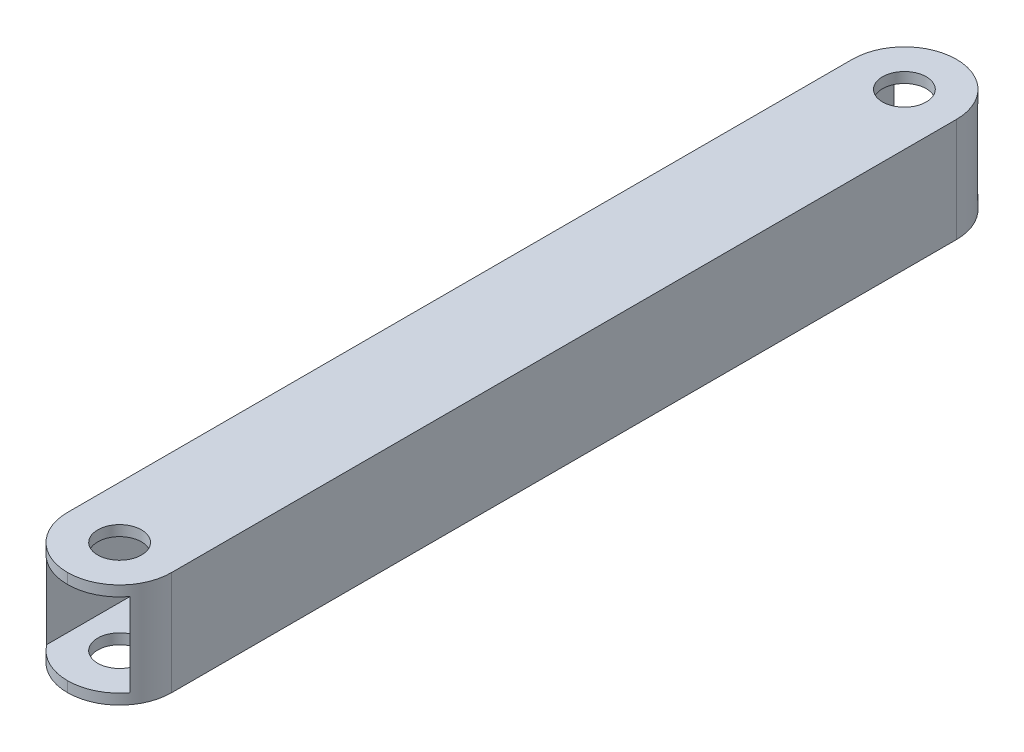
ISO-10303-21;
HEADER;
FILE_DESCRIPTION(('STEP AP214'),'2;1');
FILE_NAME('part.step','',(''),(''),'','','');
FILE_SCHEMA(('AUTOMOTIVE_DESIGN { 1 0 10303 214 1 1 1 1 }'));
ENDSEC;
DATA;
#1=APPLICATION_CONTEXT('core data for automotive mechanical design processes');
#2=APPLICATION_PROTOCOL_DEFINITION('international standard','automotive_design',2000,#1);
#3=PRODUCT_CONTEXT('',#1,'mechanical');
#4=PRODUCT('Part','Part','',(#3));
#5=PRODUCT_RELATED_PRODUCT_CATEGORY('part','',(#4));
#6=PRODUCT_DEFINITION_FORMATION('','',#4);
#7=PRODUCT_DEFINITION_CONTEXT('part definition',#1,'design');
#8=PRODUCT_DEFINITION('design','',#6,#7);
#9=PRODUCT_DEFINITION_SHAPE('','',#8);
#10=(LENGTH_UNIT() NAMED_UNIT(*) SI_UNIT(.MILLI.,.METRE.));
#11=(NAMED_UNIT(*) PLANE_ANGLE_UNIT() SI_UNIT($,.RADIAN.));
#12=(NAMED_UNIT(*) SI_UNIT($,.STERADIAN.) SOLID_ANGLE_UNIT());
#13=UNCERTAINTY_MEASURE_WITH_UNIT(LENGTH_MEASURE(1.E-05),#10,'distance_accuracy_value','');
#14=(GEOMETRIC_REPRESENTATION_CONTEXT(3) GLOBAL_UNCERTAINTY_ASSIGNED_CONTEXT((#13)) GLOBAL_UNIT_ASSIGNED_CONTEXT((#10,
#11,#12)) REPRESENTATION_CONTEXT('',''));
#15=CARTESIAN_POINT('',(0.,0.,0.));
#16=DIRECTION('',(0.,0.,1.));
#17=DIRECTION('',(1.,0.,0.));
#18=AXIS2_PLACEMENT_3D('',#15,#16,#17);
#19=CARTESIAN_POINT('',(5.,5.,85.3740671584067));
#20=DIRECTION('',(-1.,0.,0.));
#21=DIRECTION('',(0.,-1.,0.));
#22=AXIS2_PLACEMENT_3D('',#19,#20,#21);
#23=PLANE('',#22);
#24=DIRECTION('',(0.,0.,-1.));
#25=VECTOR('',#24,1.);
#26=CARTESIAN_POINT('',(5.,5.,85.3740671584067));
#27=LINE('',#26,#25);
#28=CARTESIAN_POINT('',(5.,5.,80.3740671584067));
#29=VERTEX_POINT('',#28);
#30=CARTESIAN_POINT('',(5.,5.,5.));
#31=VERTEX_POINT('',#30);
#32=EDGE_CURVE('E146',#29,#31,#27,.T.);
#33=ORIENTED_EDGE('',*,*,#32,.F.);
#34=DIRECTION('',(0.,1.,0.));
#35=VECTOR('',#34,1.);
#36=CARTESIAN_POINT('',(5.,-5.,80.3740671584067));
#37=LINE('',#36,#35);
#38=CARTESIAN_POINT('',(5.,-5.,80.3740671584067));
#39=VERTEX_POINT('',#38);
#40=EDGE_CURVE('E171',#29,#39,#37,.F.);
#41=ORIENTED_EDGE('',*,*,#40,.T.);
#42=DIRECTION('',(0.,0.,-1.));
#43=VECTOR('',#42,1.);
#44=CARTESIAN_POINT('',(5.,-5.,85.3740671584067));
#45=LINE('',#44,#43);
#46=CARTESIAN_POINT('',(5.,-5.,5.));
#47=VERTEX_POINT('',#46);
#48=EDGE_CURVE('E216',#39,#47,#45,.T.);
#49=ORIENTED_EDGE('',*,*,#48,.T.);
#50=DIRECTION('',(0.,1.,0.));
#51=VECTOR('',#50,1.);
#52=CARTESIAN_POINT('',(5.,5.,5.));
#53=LINE('',#52,#51);
#54=EDGE_CURVE('E174',#47,#31,#53,.T.);
#55=ORIENTED_EDGE('',*,*,#54,.T.);
#56=EDGE_LOOP('',(#33,#41,#49,#55));
#57=FACE_BOUND('',#56,.T.);
#58=ADVANCED_FACE('F34',(#57),#23,.F.);
#59=CARTESIAN_POINT('',(-5.,5.,85.3740671584067));
#60=DIRECTION('',(0.,-1.,0.));
#61=DIRECTION('',(0.,0.,-1.));
#62=AXIS2_PLACEMENT_3D('',#59,#60,#61);
#63=PLANE('',#62);
#64=CARTESIAN_POINT('',(0.,5.,80.3740671584067));
#65=DIRECTION('',(0.,1.,0.));
#66=DIRECTION('',(0.,0.,1.));
#67=AXIS2_PLACEMENT_3D('',#64,#65,#66);
#68=CIRCLE('',#67,2.10000000000001);
#69=CARTESIAN_POINT('',(0.,5.,82.4740671584067));
#70=VERTEX_POINT('',#69);
#71=EDGE_CURVE('E158',#70,#70,#68,.T.);
#72=ORIENTED_EDGE('',*,*,#71,.F.);
#73=EDGE_LOOP('',(#72));
#74=FACE_BOUND('',#73,.T.);
#75=CARTESIAN_POINT('',(0.,5.,5.));
#76=DIRECTION('',(0.,1.,0.));
#77=DIRECTION('',(0.,0.,1.));
#78=AXIS2_PLACEMENT_3D('',#75,#76,#77);
#79=CIRCLE('',#78,2.1);
#80=CARTESIAN_POINT('',(0.,5.,7.1));
#81=VERTEX_POINT('',#80);
#82=EDGE_CURVE('E209',#81,#81,#79,.T.);
#83=ORIENTED_EDGE('',*,*,#82,.F.);
#84=EDGE_LOOP('',(#83));
#85=FACE_BOUND('',#84,.T.);
#86=CARTESIAN_POINT('',(0.,5.,80.3740671584067));
#87=DIRECTION('',(0.,-1.,0.));
#88=DIRECTION('',(0.,0.,-1.));
#89=AXIS2_PLACEMENT_3D('',#86,#87,#88);
#90=CIRCLE('',#89,5.);
#91=CARTESIAN_POINT('',(-5.,5.,80.3740671584067));
#92=VERTEX_POINT('',#91);
#93=CARTESIAN_POINT('',(0.,5.,85.3740671584067));
#94=VERTEX_POINT('',#93);
#95=EDGE_CURVE('E179',#92,#94,#90,.F.);
#96=ORIENTED_EDGE('',*,*,#95,.T.);
#97=CARTESIAN_POINT('',(0.,5.,80.3740671584067));
#98=DIRECTION('',(0.,-1.,0.));
#99=DIRECTION('',(0.,0.,-1.));
#100=AXIS2_PLACEMENT_3D('',#97,#98,#99);
#101=CIRCLE('',#100,5.);
#102=EDGE_CURVE('E177',#94,#29,#101,.F.);
#103=ORIENTED_EDGE('',*,*,#102,.T.);
#104=ORIENTED_EDGE('',*,*,#32,.T.);
#105=CARTESIAN_POINT('',(0.,5.,5.));
#106=DIRECTION('',(0.,-1.,0.));
#107=DIRECTION('',(0.,0.,-1.));
#108=AXIS2_PLACEMENT_3D('',#105,#106,#107);
#109=CIRCLE('',#108,5.);
#110=CARTESIAN_POINT('',(0.,5.,0.));
#111=VERTEX_POINT('',#110);
#112=EDGE_CURVE('E181',#31,#111,#109,.F.);
#113=ORIENTED_EDGE('',*,*,#112,.T.);
#114=CARTESIAN_POINT('',(0.,5.,5.));
#115=DIRECTION('',(0.,-1.,0.));
#116=DIRECTION('',(0.,0.,-1.));
#117=AXIS2_PLACEMENT_3D('',#114,#115,#116);
#118=CIRCLE('',#117,5.);
#119=CARTESIAN_POINT('',(-5.,5.,5.));
#120=VERTEX_POINT('',#119);
#121=EDGE_CURVE('E183',#111,#120,#118,.F.);
#122=ORIENTED_EDGE('',*,*,#121,.T.);
#123=DIRECTION('',(0.,0.,-1.));
#124=VECTOR('',#123,1.);
#125=CARTESIAN_POINT('',(-5.,5.,85.3740671584067));
#126=LINE('',#125,#124);
#127=EDGE_CURVE('E212',#92,#120,#126,.T.);
#128=ORIENTED_EDGE('',*,*,#127,.F.);
#129=EDGE_LOOP('',(#96,#103,#104,#113,#122,#128));
#130=FACE_BOUND('',#129,.T.);
#131=ADVANCED_FACE('F245',(#74,#85,#130),#63,.F.);
#132=CARTESIAN_POINT('',(-5.,5.,85.3740671584067));
#133=DIRECTION('',(1.,0.,0.));
#134=DIRECTION('',(0.,0.,-1.));
#135=AXIS2_PLACEMENT_3D('',#132,#133,#134);
#136=PLANE('',#135);
#137=DIRECTION('',(0.,0.,-1.));
#138=VECTOR('',#137,1.);
#139=CARTESIAN_POINT('',(-5.,-5.,85.3740671584067));
#140=LINE('',#139,#138);
#141=CARTESIAN_POINT('',(-5.,-5.,80.3740671584067));
#142=VERTEX_POINT('',#141);
#143=CARTESIAN_POINT('',(-5.,-5.,5.));
#144=VERTEX_POINT('',#143);
#145=EDGE_CURVE('E214',#142,#144,#140,.T.);
#146=ORIENTED_EDGE('',*,*,#145,.F.);
#147=DIRECTION('',(0.,-1.,0.));
#148=VECTOR('',#147,1.);
#149=CARTESIAN_POINT('',(-5.,5.,80.3740671584067));
#150=LINE('',#149,#148);
#151=EDGE_CURVE('E11',#142,#92,#150,.F.);
#152=ORIENTED_EDGE('',*,*,#151,.T.);
#153=ORIENTED_EDGE('',*,*,#127,.T.);
#154=DIRECTION('',(0.,-1.,0.));
#155=VECTOR('',#154,1.);
#156=CARTESIAN_POINT('',(-5.,5.,5.));
#157=LINE('',#156,#155);
#158=EDGE_CURVE('E43',#120,#144,#157,.T.);
#159=ORIENTED_EDGE('',*,*,#158,.T.);
#160=EDGE_LOOP('',(#146,#152,#153,#159));
#161=FACE_BOUND('',#160,.T.);
#162=ADVANCED_FACE('F248',(#161),#136,.F.);
#163=CARTESIAN_POINT('',(-5.,-5.,85.3740671584067));
#164=DIRECTION('',(0.,1.,0.));
#165=DIRECTION('',(0.,0.,1.));
#166=AXIS2_PLACEMENT_3D('',#163,#164,#165);
#167=PLANE('',#166);
#168=CARTESIAN_POINT('',(0.,-5.,80.3740671584067));
#169=DIRECTION('',(0.,1.,0.));
#170=DIRECTION('',(0.,0.,1.));
#171=AXIS2_PLACEMENT_3D('',#168,#169,#170);
#172=CIRCLE('',#171,2.10000000000001);
#173=CARTESIAN_POINT('',(0.,-5.,82.4740671584067));
#174=VERTEX_POINT('',#173);
#175=EDGE_CURVE('E235',#174,#174,#172,.T.);
#176=ORIENTED_EDGE('',*,*,#175,.T.);
#177=EDGE_LOOP('',(#176));
#178=FACE_BOUND('',#177,.T.);
#179=CARTESIAN_POINT('',(0.,-5.,5.));
#180=DIRECTION('',(0.,1.,0.));
#181=DIRECTION('',(0.,0.,1.));
#182=AXIS2_PLACEMENT_3D('',#179,#180,#181);
#183=CIRCLE('',#182,2.1);
#184=CARTESIAN_POINT('',(0.,-5.,7.1));
#185=VERTEX_POINT('',#184);
#186=EDGE_CURVE('E228',#185,#185,#183,.T.);
#187=ORIENTED_EDGE('',*,*,#186,.T.);
#188=EDGE_LOOP('',(#187));
#189=FACE_BOUND('',#188,.T.);
#190=ORIENTED_EDGE('',*,*,#48,.F.);
#191=CARTESIAN_POINT('',(0.,-5.,80.3740671584067));
#192=DIRECTION('',(0.,1.,0.));
#193=DIRECTION('',(0.,0.,1.));
#194=AXIS2_PLACEMENT_3D('',#191,#192,#193);
#195=CIRCLE('',#194,5.);
#196=CARTESIAN_POINT('',(0.,-5.,85.3740671584067));
#197=VERTEX_POINT('',#196);
#198=EDGE_CURVE('E165',#39,#197,#195,.F.);
#199=ORIENTED_EDGE('',*,*,#198,.T.);
#200=CARTESIAN_POINT('',(0.,-5.,80.3740671584067));
#201=DIRECTION('',(0.,1.,0.));
#202=DIRECTION('',(0.,0.,1.));
#203=AXIS2_PLACEMENT_3D('',#200,#201,#202);
#204=CIRCLE('',#203,5.);
#205=EDGE_CURVE('E57',#197,#142,#204,.F.);
#206=ORIENTED_EDGE('',*,*,#205,.T.);
#207=ORIENTED_EDGE('',*,*,#145,.T.);
#208=CARTESIAN_POINT('',(0.,-5.,5.));
#209=DIRECTION('',(0.,1.,0.));
#210=DIRECTION('',(0.,0.,1.));
#211=AXIS2_PLACEMENT_3D('',#208,#209,#210);
#212=CIRCLE('',#211,5.);
#213=CARTESIAN_POINT('',(0.,-5.,0.));
#214=VERTEX_POINT('',#213);
#215=EDGE_CURVE('E169',#144,#214,#212,.F.);
#216=ORIENTED_EDGE('',*,*,#215,.T.);
#217=CARTESIAN_POINT('',(0.,-5.,5.));
#218=DIRECTION('',(0.,1.,0.));
#219=DIRECTION('',(0.,0.,1.));
#220=AXIS2_PLACEMENT_3D('',#217,#218,#219);
#221=CIRCLE('',#220,5.);
#222=EDGE_CURVE('E151',#214,#47,#221,.F.);
#223=ORIENTED_EDGE('',*,*,#222,.T.);
#224=EDGE_LOOP('',(#190,#199,#206,#207,#216,#223));
#225=FACE_BOUND('',#224,.T.);
#226=ADVANCED_FACE('F268',(#178,#189,#225),#167,.F.);
#227=CARTESIAN_POINT('',(-4.,4.,85.3740671584067));
#228=DIRECTION('',(0.,-1.,0.));
#229=DIRECTION('',(0.,0.,-1.));
#230=AXIS2_PLACEMENT_3D('',#227,#228,#229);
#231=PLANE('',#230);
#232=CARTESIAN_POINT('',(0.,4.,80.3740671584067));
#233=DIRECTION('',(0.,-1.,0.));
#234=DIRECTION('',(0.,0.,-1.));
#235=AXIS2_PLACEMENT_3D('',#232,#233,#234);
#236=CIRCLE('',#235,2.10000000000001);
#237=CARTESIAN_POINT('',(0.,4.,78.2740671584067));
#238=VERTEX_POINT('',#237);
#239=EDGE_CURVE('E204',#238,#238,#236,.T.);
#240=ORIENTED_EDGE('',*,*,#239,.F.);
#241=EDGE_LOOP('',(#240));
#242=FACE_BOUND('',#241,.T.);
#243=CARTESIAN_POINT('',(0.,4.,5.));
#244=DIRECTION('',(0.,-1.,0.));
#245=DIRECTION('',(0.,0.,-1.));
#246=AXIS2_PLACEMENT_3D('',#243,#244,#245);
#247=CIRCLE('',#246,2.1);
#248=CARTESIAN_POINT('',(0.,4.,2.9));
#249=VERTEX_POINT('',#248);
#250=EDGE_CURVE('E208',#249,#249,#247,.T.);
#251=ORIENTED_EDGE('',*,*,#250,.F.);
#252=EDGE_LOOP('',(#251));
#253=FACE_BOUND('',#252,.T.);
#254=DIRECTION('',(0.,0.,-1.));
#255=VECTOR('',#254,1.);
#256=CARTESIAN_POINT('',(4.,4.,85.3740671584067));
#257=LINE('',#256,#255);
#258=CARTESIAN_POINT('',(4.,4.,83.3740671584067));
#259=VERTEX_POINT('',#258);
#260=CARTESIAN_POINT('',(4.,4.,2.));
#261=VERTEX_POINT('',#260);
#262=EDGE_CURVE('E225',#259,#261,#257,.T.);
#263=ORIENTED_EDGE('',*,*,#262,.F.);
#264=CARTESIAN_POINT('',(0.,4.,80.3740671584067));
#265=DIRECTION('',(0.,-1.,0.));
#266=DIRECTION('',(0.,0.,-1.));
#267=AXIS2_PLACEMENT_3D('',#264,#265,#266);
#268=CIRCLE('',#267,5.);
#269=CARTESIAN_POINT('',(0.,4.,85.3740671584067));
#270=VERTEX_POINT('',#269);
#271=EDGE_CURVE('E185',#259,#270,#268,.T.);
#272=ORIENTED_EDGE('',*,*,#271,.T.);
#273=CARTESIAN_POINT('',(0.,4.,80.3740671584067));
#274=DIRECTION('',(0.,-1.,0.));
#275=DIRECTION('',(0.,0.,-1.));
#276=AXIS2_PLACEMENT_3D('',#273,#274,#275);
#277=CIRCLE('',#276,5.);
#278=CARTESIAN_POINT('',(-4.,4.,83.3740671584067));
#279=VERTEX_POINT('',#278);
#280=EDGE_CURVE('E187',#270,#279,#277,.T.);
#281=ORIENTED_EDGE('',*,*,#280,.T.);
#282=DIRECTION('',(0.,0.,-1.));
#283=VECTOR('',#282,1.);
#284=CARTESIAN_POINT('',(-4.,4.,85.3740671584067));
#285=LINE('',#284,#283);
#286=CARTESIAN_POINT('',(-4.,4.,2.));
#287=VERTEX_POINT('',#286);
#288=EDGE_CURVE('E219',#279,#287,#285,.T.);
#289=ORIENTED_EDGE('',*,*,#288,.T.);
#290=CARTESIAN_POINT('',(0.,4.,5.));
#291=DIRECTION('',(0.,-1.,0.));
#292=DIRECTION('',(0.,0.,-1.));
#293=AXIS2_PLACEMENT_3D('',#290,#291,#292);
#294=CIRCLE('',#293,5.);
#295=CARTESIAN_POINT('',(0.,4.,0.));
#296=VERTEX_POINT('',#295);
#297=EDGE_CURVE('E192',#287,#296,#294,.T.);
#298=ORIENTED_EDGE('',*,*,#297,.T.);
#299=CARTESIAN_POINT('',(0.,4.,5.));
#300=DIRECTION('',(0.,-1.,0.));
#301=DIRECTION('',(0.,0.,-1.));
#302=AXIS2_PLACEMENT_3D('',#299,#300,#301);
#303=CIRCLE('',#302,5.);
#304=EDGE_CURVE('E189',#296,#261,#303,.T.);
#305=ORIENTED_EDGE('',*,*,#304,.T.);
#306=EDGE_LOOP('',(#263,#272,#281,#289,#298,#305));
#307=FACE_BOUND('',#306,.T.);
#308=ADVANCED_FACE('F272',(#242,#253,#307),#231,.T.);
#309=CARTESIAN_POINT('',(-4.,4.,85.3740671584067));
#310=DIRECTION('',(1.,0.,0.));
#311=DIRECTION('',(0.,1.,0.));
#312=AXIS2_PLACEMENT_3D('',#309,#310,#311);
#313=PLANE('',#312);
#314=ORIENTED_EDGE('',*,*,#288,.F.);
#315=DIRECTION('',(0.,1.,0.));
#316=VECTOR('',#315,1.);
#317=CARTESIAN_POINT('',(-4.,4.,83.3740671584067));
#318=LINE('',#317,#316);
#319=CARTESIAN_POINT('',(-4.,-4.,83.3740671584067));
#320=VERTEX_POINT('',#319);
#321=EDGE_CURVE('E162',#279,#320,#318,.F.);
#322=ORIENTED_EDGE('',*,*,#321,.T.);
#323=DIRECTION('',(0.,0.,-1.));
#324=VECTOR('',#323,1.);
#325=CARTESIAN_POINT('',(-4.,-4.,85.3740671584067));
#326=LINE('',#325,#324);
#327=CARTESIAN_POINT('',(-4.,-4.,2.));
#328=VERTEX_POINT('',#327);
#329=EDGE_CURVE('E222',#320,#328,#326,.T.);
#330=ORIENTED_EDGE('',*,*,#329,.T.);
#331=DIRECTION('',(0.,-1.,0.));
#332=VECTOR('',#331,1.);
#333=CARTESIAN_POINT('',(-4.,-4.,2.));
#334=LINE('',#333,#332);
#335=EDGE_CURVE('E145',#328,#287,#334,.F.);
#336=ORIENTED_EDGE('',*,*,#335,.T.);
#337=EDGE_LOOP('',(#314,#322,#330,#336));
#338=FACE_BOUND('',#337,.T.);
#339=ADVANCED_FACE('F351',(#338),#313,.T.);
#340=CARTESIAN_POINT('',(-4.,-4.,85.3740671584067));
#341=DIRECTION('',(0.,1.,0.));
#342=DIRECTION('',(-1.,0.,0.));
#343=AXIS2_PLACEMENT_3D('',#340,#341,#342);
#344=PLANE('',#343);
#345=CARTESIAN_POINT('',(0.,-4.,80.3740671584067));
#346=DIRECTION('',(0.,1.,0.));
#347=DIRECTION('',(-1.,0.,0.));
#348=AXIS2_PLACEMENT_3D('',#345,#346,#347);
#349=CIRCLE('',#348,2.10000000000001);
#350=CARTESIAN_POINT('',(-2.10000000000001,-4.,80.3740671584067));
#351=VERTEX_POINT('',#350);
#352=EDGE_CURVE('E201',#351,#351,#349,.T.);
#353=ORIENTED_EDGE('',*,*,#352,.F.);
#354=EDGE_LOOP('',(#353));
#355=FACE_BOUND('',#354,.T.);
#356=CARTESIAN_POINT('',(0.,-4.,5.));
#357=DIRECTION('',(0.,1.,0.));
#358=DIRECTION('',(-1.,0.,0.));
#359=AXIS2_PLACEMENT_3D('',#356,#357,#358);
#360=CIRCLE('',#359,2.1);
#361=CARTESIAN_POINT('',(-2.1,-4.,5.));
#362=VERTEX_POINT('',#361);
#363=EDGE_CURVE('E205',#362,#362,#360,.T.);
#364=ORIENTED_EDGE('',*,*,#363,.F.);
#365=EDGE_LOOP('',(#364));
#366=FACE_BOUND('',#365,.T.);
#367=CARTESIAN_POINT('',(0.,-4.,80.3740671584067));
#368=DIRECTION('',(0.,1.,0.));
#369=DIRECTION('',(-1.,0.,0.));
#370=AXIS2_PLACEMENT_3D('',#367,#368,#369);
#371=CIRCLE('',#370,5.);
#372=CARTESIAN_POINT('',(0.,-4.,85.3740671584067));
#373=VERTEX_POINT('',#372);
#374=EDGE_CURVE('E135',#320,#373,#371,.T.);
#375=ORIENTED_EDGE('',*,*,#374,.T.);
#376=CARTESIAN_POINT('',(0.,-4.,80.3740671584067));
#377=DIRECTION('',(0.,1.,0.));
#378=DIRECTION('',(-1.,0.,0.));
#379=AXIS2_PLACEMENT_3D('',#376,#377,#378);
#380=CIRCLE('',#379,5.);
#381=CARTESIAN_POINT('',(4.,-4.,83.3740671584067));
#382=VERTEX_POINT('',#381);
#383=EDGE_CURVE('E198',#373,#382,#380,.T.);
#384=ORIENTED_EDGE('',*,*,#383,.T.);
#385=DIRECTION('',(0.,0.,-1.));
#386=VECTOR('',#385,1.);
#387=CARTESIAN_POINT('',(4.,-4.,85.3740671584067));
#388=LINE('',#387,#386);
#389=CARTESIAN_POINT('',(4.,-4.,2.));
#390=VERTEX_POINT('',#389);
#391=EDGE_CURVE('E132',#382,#390,#388,.T.);
#392=ORIENTED_EDGE('',*,*,#391,.T.);
#393=CARTESIAN_POINT('',(0.,-4.,5.));
#394=DIRECTION('',(0.,1.,0.));
#395=DIRECTION('',(-1.,0.,0.));
#396=AXIS2_PLACEMENT_3D('',#393,#394,#395);
#397=CIRCLE('',#396,5.);
#398=CARTESIAN_POINT('',(0.,-4.,0.));
#399=VERTEX_POINT('',#398);
#400=EDGE_CURVE('E124',#390,#399,#397,.T.);
#401=ORIENTED_EDGE('',*,*,#400,.T.);
#402=CARTESIAN_POINT('',(0.,-4.,5.));
#403=DIRECTION('',(0.,1.,0.));
#404=DIRECTION('',(-1.,0.,0.));
#405=AXIS2_PLACEMENT_3D('',#402,#403,#404);
#406=CIRCLE('',#405,5.);
#407=EDGE_CURVE('E128',#399,#328,#406,.T.);
#408=ORIENTED_EDGE('',*,*,#407,.T.);
#409=ORIENTED_EDGE('',*,*,#329,.F.);
#410=EDGE_LOOP('',(#375,#384,#392,#401,#408,#409));
#411=FACE_BOUND('',#410,.T.);
#412=ADVANCED_FACE('F126',(#355,#366,#411),#344,.T.);
#413=CARTESIAN_POINT('',(4.,4.,85.3740671584067));
#414=DIRECTION('',(-1.,0.,0.));
#415=DIRECTION('',(0.,-1.,0.));
#416=AXIS2_PLACEMENT_3D('',#413,#414,#415);
#417=PLANE('',#416);
#418=ORIENTED_EDGE('',*,*,#391,.F.);
#419=DIRECTION('',(0.,-1.,0.));
#420=VECTOR('',#419,1.);
#421=CARTESIAN_POINT('',(4.,-4.,83.3740671584067));
#422=LINE('',#421,#420);
#423=EDGE_CURVE('E194',#382,#259,#422,.F.);
#424=ORIENTED_EDGE('',*,*,#423,.T.);
#425=ORIENTED_EDGE('',*,*,#262,.T.);
#426=DIRECTION('',(0.,1.,0.));
#427=VECTOR('',#426,1.);
#428=CARTESIAN_POINT('',(4.,4.,2.));
#429=LINE('',#428,#427);
#430=EDGE_CURVE('E196',#261,#390,#429,.F.);
#431=ORIENTED_EDGE('',*,*,#430,.T.);
#432=EDGE_LOOP('',(#418,#424,#425,#431));
#433=FACE_BOUND('',#432,.T.);
#434=ADVANCED_FACE('F274',(#433),#417,.T.);
#435=CARTESIAN_POINT('',(0.,-35.,5.));
#436=DIRECTION('',(0.,1.,0.));
#437=DIRECTION('',(0.,0.,1.));
#438=AXIS2_PLACEMENT_3D('',#435,#436,#437);
#439=CYLINDRICAL_SURFACE('',#438,2.1);
#440=ORIENTED_EDGE('',*,*,#363,.T.);
#441=EDGE_LOOP('',(#440));
#442=FACE_BOUND('',#441,.T.);
#443=ORIENTED_EDGE('',*,*,#186,.F.);
#444=EDGE_LOOP('',(#443));
#445=FACE_BOUND('',#444,.T.);
#446=ADVANCED_FACE('F329',(#442,#445),#439,.F.);
#447=ORIENTED_EDGE('',*,*,#250,.T.);
#448=EDGE_LOOP('',(#447));
#449=FACE_BOUND('',#448,.T.);
#450=ORIENTED_EDGE('',*,*,#82,.T.);
#451=EDGE_LOOP('',(#450));
#452=FACE_BOUND('',#451,.T.);
#453=ADVANCED_FACE('F322',(#449,#452),#439,.F.);
#454=CARTESIAN_POINT('',(0.,-35.,80.3740671584067));
#455=DIRECTION('',(0.,1.,0.));
#456=DIRECTION('',(0.,0.,1.));
#457=AXIS2_PLACEMENT_3D('',#454,#455,#456);
#458=CYLINDRICAL_SURFACE('',#457,2.10000000000001);
#459=ORIENTED_EDGE('',*,*,#352,.T.);
#460=EDGE_LOOP('',(#459));
#461=FACE_BOUND('',#460,.T.);
#462=ORIENTED_EDGE('',*,*,#175,.F.);
#463=EDGE_LOOP('',(#462));
#464=FACE_BOUND('',#463,.T.);
#465=ADVANCED_FACE('F314',(#461,#464),#458,.F.);
#466=ORIENTED_EDGE('',*,*,#239,.T.);
#467=EDGE_LOOP('',(#466));
#468=FACE_BOUND('',#467,.T.);
#469=ORIENTED_EDGE('',*,*,#71,.T.);
#470=EDGE_LOOP('',(#469));
#471=FACE_BOUND('',#470,.T.);
#472=ADVANCED_FACE('F243',(#468,#471),#458,.F.);
#473=CARTESIAN_POINT('',(0.,0.,80.3740671584067));
#474=DIRECTION('',(0.,1.,0.));
#475=DIRECTION('',(0.,0.,1.));
#476=AXIS2_PLACEMENT_3D('',#473,#474,#475);
#477=CYLINDRICAL_SURFACE('',#476,5.);
#478=ORIENTED_EDGE('',*,*,#151,.F.);
#479=ORIENTED_EDGE('',*,*,#205,.F.);
#480=DIRECTION('',(0.,-1.,0.));
#481=VECTOR('',#480,1.);
#482=CARTESIAN_POINT('',(0.,-5.,85.3740671584067));
#483=LINE('',#482,#481);
#484=EDGE_CURVE('E155',#373,#197,#483,.T.);
#485=ORIENTED_EDGE('',*,*,#484,.F.);
#486=ORIENTED_EDGE('',*,*,#374,.F.);
#487=ORIENTED_EDGE('',*,*,#321,.F.);
#488=ORIENTED_EDGE('',*,*,#280,.F.);
#489=DIRECTION('',(0.,-1.,0.));
#490=VECTOR('',#489,1.);
#491=CARTESIAN_POINT('',(0.,-5.,85.3740671584067));
#492=LINE('',#491,#490);
#493=EDGE_CURVE('E153',#94,#270,#492,.T.);
#494=ORIENTED_EDGE('',*,*,#493,.F.);
#495=ORIENTED_EDGE('',*,*,#95,.F.);
#496=EDGE_LOOP('',(#478,#479,#485,#486,#487,#488,#494,#495));
#497=FACE_BOUND('',#496,.T.);
#498=ADVANCED_FACE('F260',(#497),#477,.T.);
#499=CARTESIAN_POINT('',(0.,0.,80.3740671584067));
#500=DIRECTION('',(0.,-1.,0.));
#501=DIRECTION('',(1.,0.,0.));
#502=AXIS2_PLACEMENT_3D('',#499,#500,#501);
#503=CYLINDRICAL_SURFACE('',#502,5.);
#504=ORIENTED_EDGE('',*,*,#198,.F.);
#505=ORIENTED_EDGE('',*,*,#40,.F.);
#506=ORIENTED_EDGE('',*,*,#102,.F.);
#507=ORIENTED_EDGE('',*,*,#493,.T.);
#508=ORIENTED_EDGE('',*,*,#271,.F.);
#509=ORIENTED_EDGE('',*,*,#423,.F.);
#510=ORIENTED_EDGE('',*,*,#383,.F.);
#511=ORIENTED_EDGE('',*,*,#484,.T.);
#512=EDGE_LOOP('',(#504,#505,#506,#507,#508,#509,#510,#511));
#513=FACE_BOUND('',#512,.T.);
#514=ADVANCED_FACE('F265',(#513),#503,.T.);
#515=CARTESIAN_POINT('',(0.,5.,5.));
#516=DIRECTION('',(0.,-1.,0.));
#517=DIRECTION('',(0.,0.,-1.));
#518=AXIS2_PLACEMENT_3D('',#515,#516,#517);
#519=CYLINDRICAL_SURFACE('',#518,5.);
#520=DIRECTION('',(0.,-1.,0.));
#521=VECTOR('',#520,1.);
#522=CARTESIAN_POINT('',(0.,0.,0.));
#523=LINE('',#522,#521);
#524=EDGE_CURVE('E38',#296,#111,#523,.F.);
#525=ORIENTED_EDGE('',*,*,#524,.F.);
#526=ORIENTED_EDGE('',*,*,#297,.F.);
#527=ORIENTED_EDGE('',*,*,#335,.F.);
#528=ORIENTED_EDGE('',*,*,#407,.F.);
#529=DIRECTION('',(0.,-1.,0.));
#530=VECTOR('',#529,1.);
#531=CARTESIAN_POINT('',(0.,0.,0.));
#532=LINE('',#531,#530);
#533=EDGE_CURVE('E142',#214,#399,#532,.F.);
#534=ORIENTED_EDGE('',*,*,#533,.F.);
#535=ORIENTED_EDGE('',*,*,#215,.F.);
#536=ORIENTED_EDGE('',*,*,#158,.F.);
#537=ORIENTED_EDGE('',*,*,#121,.F.);
#538=EDGE_LOOP('',(#525,#526,#527,#528,#534,#535,#536,#537));
#539=FACE_BOUND('',#538,.T.);
#540=ADVANCED_FACE('F36',(#539),#519,.T.);
#541=CARTESIAN_POINT('',(0.,5.,5.));
#542=DIRECTION('',(0.,1.,0.));
#543=DIRECTION('',(-1.,0.,0.));
#544=AXIS2_PLACEMENT_3D('',#541,#542,#543);
#545=CYLINDRICAL_SURFACE('',#544,5.);
#546=ORIENTED_EDGE('',*,*,#304,.F.);
#547=ORIENTED_EDGE('',*,*,#524,.T.);
#548=ORIENTED_EDGE('',*,*,#112,.F.);
#549=ORIENTED_EDGE('',*,*,#54,.F.);
#550=ORIENTED_EDGE('',*,*,#222,.F.);
#551=ORIENTED_EDGE('',*,*,#533,.T.);
#552=ORIENTED_EDGE('',*,*,#400,.F.);
#553=ORIENTED_EDGE('',*,*,#430,.F.);
#554=EDGE_LOOP('',(#546,#547,#548,#549,#550,#551,#552,#553));
#555=FACE_BOUND('',#554,.T.);
#556=ADVANCED_FACE('F149',(#555),#545,.T.);
#557=CLOSED_SHELL('',(#58,#131,#162,#226,#308,#339,#412,#434,#446,#453,#465,#472,#498,#514,#540,#556));
#558=MANIFOLD_SOLID_BREP('B2',#557);
#559=ADVANCED_BREP_SHAPE_REPRESENTATION('',(#18,#558),#14);
#560=SHAPE_DEFINITION_REPRESENTATION(#9,#559);
ENDSEC;
END-ISO-10303-21;
